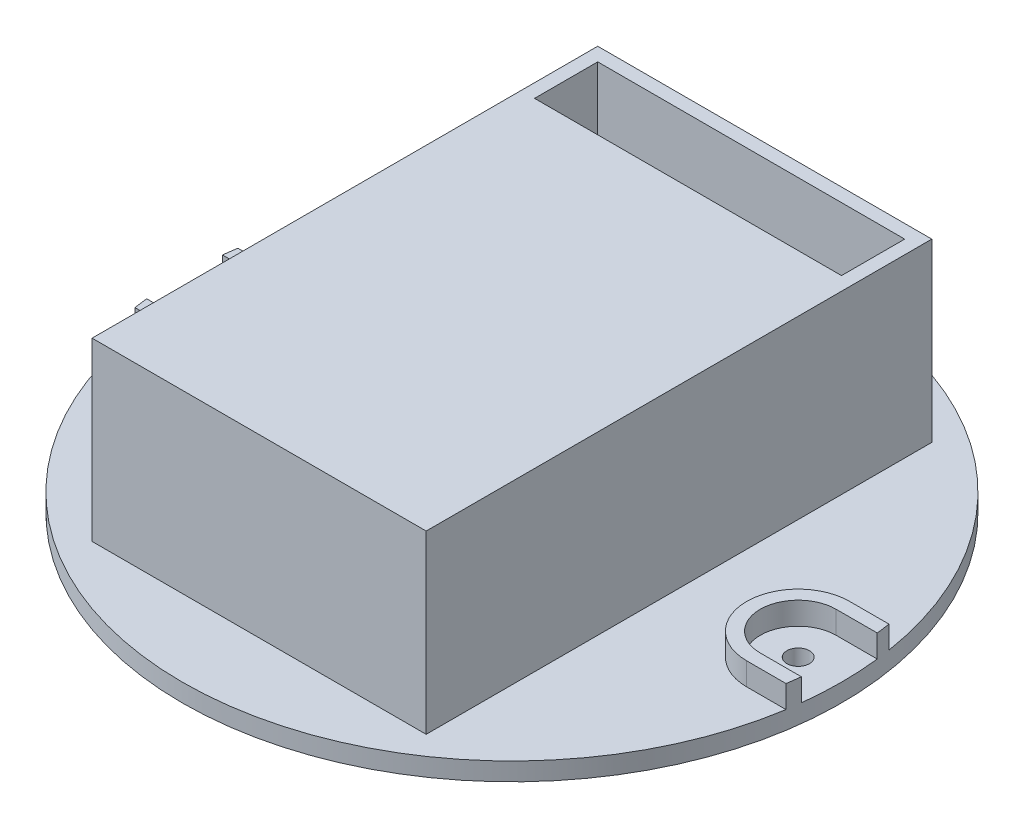
ISO-10303-21;
HEADER;
FILE_DESCRIPTION(('STEP AP214'),'2;1');
FILE_NAME('part.step','',(''),(''),'','','');
FILE_SCHEMA(('AUTOMOTIVE_DESIGN { 1 0 10303 214 1 1 1 1 }'));
ENDSEC;
DATA;
#1=APPLICATION_CONTEXT('core data for automotive mechanical design processes');
#2=APPLICATION_PROTOCOL_DEFINITION('international standard','automotive_design',2000,#1);
#3=PRODUCT_CONTEXT('',#1,'mechanical');
#4=PRODUCT('Part','Part','',(#3));
#5=PRODUCT_RELATED_PRODUCT_CATEGORY('part','',(#4));
#6=PRODUCT_DEFINITION_FORMATION('','',#4);
#7=PRODUCT_DEFINITION_CONTEXT('part definition',#1,'design');
#8=PRODUCT_DEFINITION('design','',#6,#7);
#9=PRODUCT_DEFINITION_SHAPE('','',#8);
#10=(LENGTH_UNIT() NAMED_UNIT(*) SI_UNIT(.MILLI.,.METRE.));
#11=(NAMED_UNIT(*) PLANE_ANGLE_UNIT() SI_UNIT($,.RADIAN.));
#12=(NAMED_UNIT(*) SI_UNIT($,.STERADIAN.) SOLID_ANGLE_UNIT());
#13=UNCERTAINTY_MEASURE_WITH_UNIT(LENGTH_MEASURE(1.E-05),#10,'distance_accuracy_value','');
#14=(GEOMETRIC_REPRESENTATION_CONTEXT(3) GLOBAL_UNCERTAINTY_ASSIGNED_CONTEXT((#13)) GLOBAL_UNIT_ASSIGNED_CONTEXT((#10,
#11,#12)) REPRESENTATION_CONTEXT('',''));
#15=CARTESIAN_POINT('',(0.,0.,0.));
#16=DIRECTION('',(0.,0.,1.));
#17=DIRECTION('',(1.,0.,0.));
#18=AXIS2_PLACEMENT_3D('',#15,#16,#17);
#19=CARTESIAN_POINT('',(0.,-90.5,-26.5));
#20=DIRECTION('',(0.,0.,-1.));
#21=DIRECTION('',(-1.,0.,0.));
#22=AXIS2_PLACEMENT_3D('',#19,#20,#21);
#23=PLANE('',#22);
#24=DIRECTION('',(0.,-1.,0.));
#25=VECTOR('',#24,1.);
#26=CARTESIAN_POINT('',(17.,-90.5,-26.5));
#27=LINE('',#26,#25);
#28=CARTESIAN_POINT('',(17.,-90.5,-26.5));
#29=VERTEX_POINT('',#28);
#30=CARTESIAN_POINT('',(17.,-112.,-26.5));
#31=VERTEX_POINT('',#30);
#32=EDGE_CURVE('E209',#29,#31,#27,.T.);
#33=ORIENTED_EDGE('',*,*,#32,.F.);
#34=DIRECTION('',(1.,0.,0.));
#35=VECTOR('',#34,1.);
#36=CARTESIAN_POINT('',(-17.,-90.5,-26.5));
#37=LINE('',#36,#35);
#38=CARTESIAN_POINT('',(-17.,-90.5,-26.5));
#39=VERTEX_POINT('',#38);
#40=EDGE_CURVE('E211',#39,#29,#37,.T.);
#41=ORIENTED_EDGE('',*,*,#40,.F.);
#42=DIRECTION('',(0.,-1.,0.));
#43=VECTOR('',#42,1.);
#44=CARTESIAN_POINT('',(-17.,-90.5,-26.5));
#45=LINE('',#44,#43);
#46=CARTESIAN_POINT('',(-17.,-112.,-26.5));
#47=VERTEX_POINT('',#46);
#48=EDGE_CURVE('E217',#39,#47,#45,.T.);
#49=ORIENTED_EDGE('',*,*,#48,.T.);
#50=DIRECTION('',(1.,0.,0.));
#51=VECTOR('',#50,1.);
#52=CARTESIAN_POINT('',(-17.,-112.,-26.5));
#53=LINE('',#52,#51);
#54=EDGE_CURVE('E214',#47,#31,#53,.T.);
#55=ORIENTED_EDGE('',*,*,#54,.T.);
#56=EDGE_LOOP('',(#33,#41,#49,#55));
#57=FACE_BOUND('',#56,.T.);
#58=ADVANCED_FACE('F35',(#57),#23,.F.);
#59=CARTESIAN_POINT('',(-17.,-90.5,0.));
#60=DIRECTION('',(-1.,0.,0.));
#61=DIRECTION('',(0.,0.,1.));
#62=AXIS2_PLACEMENT_3D('',#59,#60,#61);
#63=PLANE('',#62);
#64=ORIENTED_EDGE('',*,*,#48,.F.);
#65=DIRECTION('',(0.,0.,-1.));
#66=VECTOR('',#65,1.);
#67=CARTESIAN_POINT('',(-17.,-90.5,-26.5));
#68=LINE('',#67,#66);
#69=CARTESIAN_POINT('',(-17.,-90.5,-19.5));
#70=VERTEX_POINT('',#69);
#71=EDGE_CURVE('E230',#70,#39,#68,.T.);
#72=ORIENTED_EDGE('',*,*,#71,.F.);
#73=DIRECTION('',(0.,-1.,0.));
#74=VECTOR('',#73,1.);
#75=CARTESIAN_POINT('',(-17.,-0.498999999999999,-19.5));
#76=LINE('',#75,#74);
#77=CARTESIAN_POINT('',(-17.,-92.,-19.5));
#78=VERTEX_POINT('',#77);
#79=EDGE_CURVE('E226',#70,#78,#76,.T.);
#80=ORIENTED_EDGE('',*,*,#79,.T.);
#81=DIRECTION('',(0.,0.,1.));
#82=VECTOR('',#81,1.);
#83=CARTESIAN_POINT('',(-17.,-92.,0.));
#84=LINE('',#83,#82);
#85=CARTESIAN_POINT('',(-17.,-92.,26.5));
#86=VERTEX_POINT('',#85);
#87=EDGE_CURVE('E248',#78,#86,#84,.T.);
#88=ORIENTED_EDGE('',*,*,#87,.T.);
#89=DIRECTION('',(0.,-1.,0.));
#90=VECTOR('',#89,1.);
#91=CARTESIAN_POINT('',(-17.,-90.5,26.5));
#92=LINE('',#91,#90);
#93=CARTESIAN_POINT('',(-17.,-112.,26.5));
#94=VERTEX_POINT('',#93);
#95=EDGE_CURVE('E288',#86,#94,#92,.T.);
#96=ORIENTED_EDGE('',*,*,#95,.T.);
#97=DIRECTION('',(0.,0.,-1.));
#98=VECTOR('',#97,1.);
#99=CARTESIAN_POINT('',(-17.,-112.,26.5));
#100=LINE('',#99,#98);
#101=EDGE_CURVE('E245',#94,#47,#100,.T.);
#102=ORIENTED_EDGE('',*,*,#101,.T.);
#103=EDGE_LOOP('',(#64,#72,#80,#88,#96,#102));
#104=FACE_BOUND('',#103,.T.);
#105=ADVANCED_FACE('F485',(#104),#63,.F.);
#106=CARTESIAN_POINT('',(0.,-90.5,26.5));
#107=DIRECTION('',(0.,0.,-1.));
#108=DIRECTION('',(-1.,0.,0.));
#109=AXIS2_PLACEMENT_3D('',#106,#107,#108);
#110=PLANE('',#109);
#111=DIRECTION('',(-1.,0.,0.));
#112=VECTOR('',#111,1.);
#113=CARTESIAN_POINT('',(0.,-92.,26.5));
#114=LINE('',#113,#112);
#115=CARTESIAN_POINT('',(17.,-92.,26.5));
#116=VERTEX_POINT('',#115);
#117=EDGE_CURVE('E250',#116,#86,#114,.T.);
#118=ORIENTED_EDGE('',*,*,#117,.F.);
#119=DIRECTION('',(0.,-1.,0.));
#120=VECTOR('',#119,1.);
#121=CARTESIAN_POINT('',(17.,-90.5,26.5));
#122=LINE('',#121,#120);
#123=CARTESIAN_POINT('',(17.,-112.,26.5));
#124=VERTEX_POINT('',#123);
#125=EDGE_CURVE('E280',#116,#124,#122,.T.);
#126=ORIENTED_EDGE('',*,*,#125,.T.);
#127=DIRECTION('',(1.,0.,0.));
#128=VECTOR('',#127,1.);
#129=CARTESIAN_POINT('',(-17.,-112.,26.5));
#130=LINE('',#129,#128);
#131=EDGE_CURVE('E225',#94,#124,#130,.T.);
#132=ORIENTED_EDGE('',*,*,#131,.F.);
#133=ORIENTED_EDGE('',*,*,#95,.F.);
#134=EDGE_LOOP('',(#118,#126,#132,#133));
#135=FACE_BOUND('',#134,.T.);
#136=ADVANCED_FACE('F490',(#135),#110,.T.);
#137=CARTESIAN_POINT('',(17.,-90.5,0.));
#138=DIRECTION('',(-1.,0.,0.));
#139=DIRECTION('',(0.,0.,1.));
#140=AXIS2_PLACEMENT_3D('',#137,#138,#139);
#141=PLANE('',#140);
#142=DIRECTION('',(0.,0.,1.));
#143=VECTOR('',#142,1.);
#144=CARTESIAN_POINT('',(17.,-92.,0.));
#145=LINE('',#144,#143);
#146=CARTESIAN_POINT('',(17.,-92.,-19.5));
#147=VERTEX_POINT('',#146);
#148=EDGE_CURVE('E253',#147,#116,#145,.T.);
#149=ORIENTED_EDGE('',*,*,#148,.F.);
#150=DIRECTION('',(0.,-1.,0.));
#151=VECTOR('',#150,1.);
#152=CARTESIAN_POINT('',(17.,-0.498999999999999,-19.5));
#153=LINE('',#152,#151);
#154=CARTESIAN_POINT('',(17.,-90.5,-19.5));
#155=VERTEX_POINT('',#154);
#156=EDGE_CURVE('E51',#155,#147,#153,.T.);
#157=ORIENTED_EDGE('',*,*,#156,.F.);
#158=DIRECTION('',(0.,0.,1.));
#159=VECTOR('',#158,1.);
#160=CARTESIAN_POINT('',(17.,-90.5,-26.5));
#161=LINE('',#160,#159);
#162=EDGE_CURVE('E221',#29,#155,#161,.T.);
#163=ORIENTED_EDGE('',*,*,#162,.F.);
#164=ORIENTED_EDGE('',*,*,#32,.T.);
#165=DIRECTION('',(0.,0.,-1.));
#166=VECTOR('',#165,1.);
#167=CARTESIAN_POINT('',(17.,-112.,26.5));
#168=LINE('',#167,#166);
#169=EDGE_CURVE('E242',#124,#31,#168,.T.);
#170=ORIENTED_EDGE('',*,*,#169,.F.);
#171=ORIENTED_EDGE('',*,*,#125,.F.);
#172=EDGE_LOOP('',(#149,#157,#163,#164,#170,#171));
#173=FACE_BOUND('',#172,.T.);
#174=ADVANCED_FACE('F222',(#173),#141,.T.);
#175=CARTESIAN_POINT('',(0.,-92.,0.));
#176=DIRECTION('',(0.,-1.,0.));
#177=DIRECTION('',(0.,0.,-1.));
#178=AXIS2_PLACEMENT_3D('',#175,#176,#177);
#179=PLANE('',#178);
#180=DIRECTION('',(-1.,0.,0.));
#181=VECTOR('',#180,1.);
#182=CARTESIAN_POINT('',(17.,-92.,-19.5));
#183=LINE('',#182,#181);
#184=EDGE_CURVE('E231',#147,#78,#183,.T.);
#185=ORIENTED_EDGE('',*,*,#184,.F.);
#186=ORIENTED_EDGE('',*,*,#148,.T.);
#187=ORIENTED_EDGE('',*,*,#117,.T.);
#188=ORIENTED_EDGE('',*,*,#87,.F.);
#189=EDGE_LOOP('',(#185,#186,#187,#188));
#190=FACE_BOUND('',#189,.T.);
#191=ADVANCED_FACE('F502',(#190),#179,.T.);
#192=CARTESIAN_POINT('',(0.,-110.,0.));
#193=DIRECTION('',(0.,1.,0.));
#194=DIRECTION('',(0.,0.,1.));
#195=AXIS2_PLACEMENT_3D('',#192,#193,#194);
#196=PLANE('',#195);
#197=DIRECTION('',(0.,0.,-1.));
#198=VECTOR('',#197,1.);
#199=CARTESIAN_POINT('',(-18.5,-110.,0.));
#200=LINE('',#199,#198);
#201=CARTESIAN_POINT('',(-18.5,-110.,28.));
#202=VERTEX_POINT('',#201);
#203=CARTESIAN_POINT('',(-18.5,-110.,-28.));
#204=VERTEX_POINT('',#203);
#205=EDGE_CURVE('E255',#202,#204,#200,.T.);
#206=ORIENTED_EDGE('',*,*,#205,.T.);
#207=DIRECTION('',(1.,0.,0.));
#208=VECTOR('',#207,1.);
#209=CARTESIAN_POINT('',(0.,-110.,-28.));
#210=LINE('',#209,#208);
#211=CARTESIAN_POINT('',(18.5,-110.,-28.));
#212=VERTEX_POINT('',#211);
#213=EDGE_CURVE('E260',#204,#212,#210,.T.);
#214=ORIENTED_EDGE('',*,*,#213,.T.);
#215=DIRECTION('',(0.,0.,-1.));
#216=VECTOR('',#215,1.);
#217=CARTESIAN_POINT('',(18.5,-110.,0.));
#218=LINE('',#217,#216);
#219=CARTESIAN_POINT('',(18.5,-110.,28.));
#220=VERTEX_POINT('',#219);
#221=EDGE_CURVE('E272',#220,#212,#218,.T.);
#222=ORIENTED_EDGE('',*,*,#221,.F.);
#223=DIRECTION('',(1.,0.,0.));
#224=VECTOR('',#223,1.);
#225=CARTESIAN_POINT('',(0.,-110.,28.));
#226=LINE('',#225,#224);
#227=EDGE_CURVE('E269',#202,#220,#226,.T.);
#228=ORIENTED_EDGE('',*,*,#227,.F.);
#229=EDGE_LOOP('',(#206,#214,#222,#228));
#230=FACE_BOUND('',#229,.T.);
#231=CARTESIAN_POINT('',(31.7,-110.,0.));
#232=DIRECTION('',(0.,1.,0.));
#233=DIRECTION('',(0.,0.,1.));
#234=AXIS2_PLACEMENT_3D('',#231,#232,#233);
#235=CIRCLE('',#234,5.69999999999999);
#236=CARTESIAN_POINT('',(31.7,-110.,-5.7));
#237=VERTEX_POINT('',#236);
#238=CARTESIAN_POINT('',(31.7,-110.,5.69999999999999));
#239=VERTEX_POINT('',#238);
#240=EDGE_CURVE('E313',#237,#239,#235,.T.);
#241=ORIENTED_EDGE('',*,*,#240,.F.);
#242=DIRECTION('',(-1.,0.,0.));
#243=VECTOR('',#242,1.);
#244=CARTESIAN_POINT('',(0.,-110.,-5.69999999999998));
#245=LINE('',#244,#243);
#246=CARTESIAN_POINT('',(36.0521843998391,-110.,-5.69999999999999));
#247=VERTEX_POINT('',#246);
#248=EDGE_CURVE('E285',#247,#237,#245,.T.);
#249=ORIENTED_EDGE('',*,*,#248,.F.);
#250=CARTESIAN_POINT('',(0.,-110.,0.));
#251=DIRECTION('',(0.,1.,0.));
#252=DIRECTION('',(0.,0.,1.));
#253=AXIS2_PLACEMENT_3D('',#250,#251,#252);
#254=CIRCLE('',#253,36.5);
#255=CARTESIAN_POINT('',(-36.0521843998391,-110.,-5.69999999999999));
#256=VERTEX_POINT('',#255);
#257=EDGE_CURVE('E405',#247,#256,#254,.T.);
#258=ORIENTED_EDGE('',*,*,#257,.T.);
#259=DIRECTION('',(1.,0.,0.));
#260=VECTOR('',#259,1.);
#261=CARTESIAN_POINT('',(0.,-110.,-5.70000000000019));
#262=LINE('',#261,#260);
#263=CARTESIAN_POINT('',(-31.7,-110.,-5.70000000000001));
#264=VERTEX_POINT('',#263);
#265=EDGE_CURVE('E374',#256,#264,#262,.T.);
#266=ORIENTED_EDGE('',*,*,#265,.T.);
#267=CARTESIAN_POINT('',(-31.7,-110.,0.));
#268=DIRECTION('',(0.,1.,0.));
#269=DIRECTION('',(0.,0.,1.));
#270=AXIS2_PLACEMENT_3D('',#267,#268,#269);
#271=CIRCLE('',#270,5.70000000000001);
#272=CARTESIAN_POINT('',(-31.7,-110.,5.70000000000001));
#273=VERTEX_POINT('',#272);
#274=EDGE_CURVE('E371',#273,#264,#271,.T.);
#275=ORIENTED_EDGE('',*,*,#274,.F.);
#276=DIRECTION('',(1.,0.,0.));
#277=VECTOR('',#276,1.);
#278=CARTESIAN_POINT('',(0.,-110.,5.70000000000001));
#279=LINE('',#278,#277);
#280=CARTESIAN_POINT('',(-36.0521843998391,-110.,5.70000000000001));
#281=VERTEX_POINT('',#280);
#282=EDGE_CURVE('E348',#281,#273,#279,.T.);
#283=ORIENTED_EDGE('',*,*,#282,.F.);
#284=CARTESIAN_POINT('',(36.0521843998391,-110.,5.7));
#285=VERTEX_POINT('',#284);
#286=EDGE_CURVE('E39',#281,#285,#254,.T.);
#287=ORIENTED_EDGE('',*,*,#286,.T.);
#288=DIRECTION('',(-1.,0.,0.));
#289=VECTOR('',#288,1.);
#290=CARTESIAN_POINT('',(0.,-110.,5.69999999999994));
#291=LINE('',#290,#289);
#292=EDGE_CURVE('E316',#285,#239,#291,.T.);
#293=ORIENTED_EDGE('',*,*,#292,.T.);
#294=EDGE_LOOP('',(#241,#249,#258,#266,#275,#283,#287,#293));
#295=FACE_BOUND('',#294,.T.);
#296=ADVANCED_FACE('F439',(#230,#295),#196,.T.);
#297=CARTESIAN_POINT('',(31.7,-110.,0.));
#298=DIRECTION('',(0.,1.,0.));
#299=DIRECTION('',(0.,0.,1.));
#300=AXIS2_PLACEMENT_3D('',#297,#298,#299);
#301=CIRCLE('',#300,1.25);
#302=CARTESIAN_POINT('',(31.7,-110.,1.24999999999999));
#303=VERTEX_POINT('',#302);
#304=EDGE_CURVE('E803',#303,#303,#301,.T.);
#305=ORIENTED_EDGE('',*,*,#304,.F.);
#306=EDGE_LOOP('',(#305));
#307=FACE_BOUND('',#306,.T.);
#308=CARTESIAN_POINT('',(31.7,-110.,0.));
#309=DIRECTION('',(0.,1.,0.));
#310=DIRECTION('',(0.,0.,1.));
#311=AXIS2_PLACEMENT_3D('',#308,#309,#310);
#312=CIRCLE('',#311,4.19999999999999);
#313=CARTESIAN_POINT('',(31.7,-110.,-4.19999999999999));
#314=VERTEX_POINT('',#313);
#315=CARTESIAN_POINT('',(31.7,-110.,4.19999999999999));
#316=VERTEX_POINT('',#315);
#317=EDGE_CURVE('E321',#314,#316,#312,.T.);
#318=ORIENTED_EDGE('',*,*,#317,.T.);
#319=DIRECTION('',(-1.,0.,0.));
#320=VECTOR('',#319,1.);
#321=CARTESIAN_POINT('',(0.,-110.,4.19999999999995));
#322=LINE('',#321,#320);
#323=CARTESIAN_POINT('',(36.2575509377012,-110.,4.2));
#324=VERTEX_POINT('',#323);
#325=EDGE_CURVE('E318',#324,#316,#322,.T.);
#326=ORIENTED_EDGE('',*,*,#325,.F.);
#327=CARTESIAN_POINT('',(36.2575509377012,-110.,-4.19999999999999));
#328=VERTEX_POINT('',#327);
#329=EDGE_CURVE('E408',#324,#328,#254,.T.);
#330=ORIENTED_EDGE('',*,*,#329,.T.);
#331=DIRECTION('',(-1.,0.,0.));
#332=VECTOR('',#331,1.);
#333=CARTESIAN_POINT('',(0.,-110.,-4.19999999999999));
#334=LINE('',#333,#332);
#335=EDGE_CURVE('E295',#328,#314,#334,.T.);
#336=ORIENTED_EDGE('',*,*,#335,.T.);
#337=EDGE_LOOP('',(#318,#326,#330,#336));
#338=FACE_BOUND('',#337,.T.);
#339=ADVANCED_FACE('F469',(#307,#338),#196,.T.);
#340=CARTESIAN_POINT('',(-31.7,-110.,0.));
#341=DIRECTION('',(0.,1.,0.));
#342=DIRECTION('',(0.,0.,1.));
#343=AXIS2_PLACEMENT_3D('',#340,#341,#342);
#344=CIRCLE('',#343,1.24999999999999);
#345=CARTESIAN_POINT('',(-31.7,-110.,1.24999999999999));
#346=VERTEX_POINT('',#345);
#347=EDGE_CURVE('E795',#346,#346,#344,.T.);
#348=ORIENTED_EDGE('',*,*,#347,.F.);
#349=EDGE_LOOP('',(#348));
#350=FACE_BOUND('',#349,.T.);
#351=CARTESIAN_POINT('',(-36.2575509377012,-110.,-4.20000000000001));
#352=VERTEX_POINT('',#351);
#353=CARTESIAN_POINT('',(-36.2575509377012,-110.,4.2));
#354=VERTEX_POINT('',#353);
#355=EDGE_CURVE('E44',#352,#354,#254,.T.);
#356=ORIENTED_EDGE('',*,*,#355,.T.);
#357=DIRECTION('',(1.,0.,0.));
#358=VECTOR('',#357,1.);
#359=CARTESIAN_POINT('',(0.,-110.,4.2));
#360=LINE('',#359,#358);
#361=CARTESIAN_POINT('',(-31.7,-110.,4.2));
#362=VERTEX_POINT('',#361);
#363=EDGE_CURVE('E353',#354,#362,#360,.T.);
#364=ORIENTED_EDGE('',*,*,#363,.T.);
#365=CARTESIAN_POINT('',(-31.7,-110.,0.));
#366=DIRECTION('',(0.,1.,0.));
#367=DIRECTION('',(0.,0.,1.));
#368=AXIS2_PLACEMENT_3D('',#365,#366,#367);
#369=CIRCLE('',#368,4.2);
#370=CARTESIAN_POINT('',(-31.7,-110.,-4.20000000000001));
#371=VERTEX_POINT('',#370);
#372=EDGE_CURVE('E379',#362,#371,#369,.T.);
#373=ORIENTED_EDGE('',*,*,#372,.T.);
#374=DIRECTION('',(1.,0.,0.));
#375=VECTOR('',#374,1.);
#376=CARTESIAN_POINT('',(0.,-110.,-4.2));
#377=LINE('',#376,#375);
#378=EDGE_CURVE('E376',#352,#371,#377,.T.);
#379=ORIENTED_EDGE('',*,*,#378,.F.);
#380=EDGE_LOOP('',(#356,#364,#373,#379));
#381=FACE_BOUND('',#380,.T.);
#382=ADVANCED_FACE('F414',(#350,#381),#196,.T.);
#383=CARTESIAN_POINT('',(0.,-112.,0.));
#384=DIRECTION('',(0.,1.,0.));
#385=DIRECTION('',(0.,0.,1.));
#386=AXIS2_PLACEMENT_3D('',#383,#384,#385);
#387=CYLINDRICAL_SURFACE('',#386,36.5);
#388=CARTESIAN_POINT('',(0.,-112.,0.));
#389=DIRECTION('',(0.,1.,0.));
#390=DIRECTION('',(0.,0.,1.));
#391=AXIS2_PLACEMENT_3D('',#388,#389,#390);
#392=CIRCLE('',#391,36.5);
#393=CARTESIAN_POINT('',(0.,-112.,36.5));
#394=VERTEX_POINT('',#393);
#395=EDGE_CURVE('E11',#394,#394,#392,.T.);
#396=ORIENTED_EDGE('',*,*,#395,.T.);
#397=EDGE_LOOP('',(#396));
#398=FACE_BOUND('',#397,.T.);
#399=ORIENTED_EDGE('',*,*,#355,.F.);
#400=DIRECTION('',(0.,-1.,0.));
#401=VECTOR('',#400,1.);
#402=CARTESIAN_POINT('',(-36.2575509377012,-107.5,-4.20000000000001));
#403=LINE('',#402,#401);
#404=CARTESIAN_POINT('',(-36.2575509377012,-107.5,-4.20000000000001));
#405=VERTEX_POINT('',#404);
#406=EDGE_CURVE('E394',#405,#352,#403,.T.);
#407=ORIENTED_EDGE('',*,*,#406,.F.);
#408=CARTESIAN_POINT('',(0.,-107.5,0.));
#409=DIRECTION('',(0.,1.,0.));
#410=DIRECTION('',(0.,0.,1.));
#411=AXIS2_PLACEMENT_3D('',#408,#409,#410);
#412=CIRCLE('',#411,36.5);
#413=CARTESIAN_POINT('',(-36.0521843998391,-107.5,-5.69999999999999));
#414=VERTEX_POINT('',#413);
#415=EDGE_CURVE('E358',#414,#405,#412,.T.);
#416=ORIENTED_EDGE('',*,*,#415,.F.);
#417=DIRECTION('',(0.,-1.,0.));
#418=VECTOR('',#417,1.);
#419=CARTESIAN_POINT('',(-36.0521843998391,-107.5,-5.69999999999999));
#420=LINE('',#419,#418);
#421=EDGE_CURVE('E397',#414,#256,#420,.T.);
#422=ORIENTED_EDGE('',*,*,#421,.T.);
#423=ORIENTED_EDGE('',*,*,#257,.F.);
#424=DIRECTION('',(0.,-1.,0.));
#425=VECTOR('',#424,1.);
#426=CARTESIAN_POINT('',(36.0521843998391,-107.5,-5.69999999999999));
#427=LINE('',#426,#425);
#428=CARTESIAN_POINT('',(36.0521843998391,-107.5,-5.69999999999999));
#429=VERTEX_POINT('',#428);
#430=EDGE_CURVE('E324',#429,#247,#427,.T.);
#431=ORIENTED_EDGE('',*,*,#430,.F.);
#432=CARTESIAN_POINT('',(0.,-107.5,0.));
#433=DIRECTION('',(0.,1.,0.));
#434=DIRECTION('',(0.,0.,1.));
#435=AXIS2_PLACEMENT_3D('',#432,#433,#434);
#436=CIRCLE('',#435,36.5);
#437=CARTESIAN_POINT('',(36.2575509377012,-107.5,-4.19999999999999));
#438=VERTEX_POINT('',#437);
#439=EDGE_CURVE('E303',#438,#429,#436,.T.);
#440=ORIENTED_EDGE('',*,*,#439,.F.);
#441=DIRECTION('',(0.,-1.,0.));
#442=VECTOR('',#441,1.);
#443=CARTESIAN_POINT('',(36.2575509377012,-107.5,-4.19999999999999));
#444=LINE('',#443,#442);
#445=EDGE_CURVE('E327',#438,#328,#444,.T.);
#446=ORIENTED_EDGE('',*,*,#445,.T.);
#447=ORIENTED_EDGE('',*,*,#329,.F.);
#448=DIRECTION('',(0.,-1.,0.));
#449=VECTOR('',#448,1.);
#450=CARTESIAN_POINT('',(36.2575509377012,-107.5,4.2));
#451=LINE('',#450,#449);
#452=CARTESIAN_POINT('',(36.2575509377012,-107.5,4.2));
#453=VERTEX_POINT('',#452);
#454=EDGE_CURVE('E336',#453,#324,#451,.T.);
#455=ORIENTED_EDGE('',*,*,#454,.F.);
#456=CARTESIAN_POINT('',(36.0521843998391,-107.5,5.7));
#457=VERTEX_POINT('',#456);
#458=EDGE_CURVE('E300',#457,#453,#436,.T.);
#459=ORIENTED_EDGE('',*,*,#458,.F.);
#460=DIRECTION('',(0.,-1.,0.));
#461=VECTOR('',#460,1.);
#462=CARTESIAN_POINT('',(36.0521843998391,-107.5,5.7));
#463=LINE('',#462,#461);
#464=EDGE_CURVE('E339',#457,#285,#463,.T.);
#465=ORIENTED_EDGE('',*,*,#464,.T.);
#466=ORIENTED_EDGE('',*,*,#286,.F.);
#467=DIRECTION('',(0.,-1.,0.));
#468=VECTOR('',#467,1.);
#469=CARTESIAN_POINT('',(-36.0521843998391,-107.5,5.70000000000001));
#470=LINE('',#469,#468);
#471=CARTESIAN_POINT('',(-36.0521843998391,-107.5,5.70000000000001));
#472=VERTEX_POINT('',#471);
#473=EDGE_CURVE('E382',#472,#281,#470,.T.);
#474=ORIENTED_EDGE('',*,*,#473,.F.);
#475=CARTESIAN_POINT('',(-36.2575509377012,-107.5,4.2));
#476=VERTEX_POINT('',#475);
#477=EDGE_CURVE('E361',#476,#472,#412,.T.);
#478=ORIENTED_EDGE('',*,*,#477,.F.);
#479=DIRECTION('',(0.,-1.,0.));
#480=VECTOR('',#479,1.);
#481=CARTESIAN_POINT('',(-36.2575509377012,-107.5,4.2));
#482=LINE('',#481,#480);
#483=EDGE_CURVE('E385',#476,#354,#482,.T.);
#484=ORIENTED_EDGE('',*,*,#483,.T.);
#485=EDGE_LOOP('',(#399,#407,#416,#422,#423,#431,#440,#446,#447,#455,#459,#465,#466,#474,#478,#484));
#486=FACE_BOUND('',#485,.T.);
#487=ADVANCED_FACE('F37',(#398,#486),#387,.T.);
#488=CARTESIAN_POINT('',(0.,-112.,0.));
#489=DIRECTION('',(0.,1.,0.));
#490=DIRECTION('',(0.,0.,1.));
#491=AXIS2_PLACEMENT_3D('',#488,#489,#490);
#492=PLANE('',#491);
#493=CARTESIAN_POINT('',(31.7,-112.,0.));
#494=DIRECTION('',(0.,1.,0.));
#495=DIRECTION('',(0.,0.,1.));
#496=AXIS2_PLACEMENT_3D('',#493,#494,#495);
#497=CIRCLE('',#496,1.25);
#498=CARTESIAN_POINT('',(31.7,-112.,1.24999999999999));
#499=VERTEX_POINT('',#498);
#500=EDGE_CURVE('E800',#499,#499,#497,.F.);
#501=ORIENTED_EDGE('',*,*,#500,.F.);
#502=EDGE_LOOP('',(#501));
#503=FACE_BOUND('',#502,.T.);
#504=CARTESIAN_POINT('',(-31.7,-112.,0.));
#505=DIRECTION('',(0.,1.,0.));
#506=DIRECTION('',(0.,0.,1.));
#507=AXIS2_PLACEMENT_3D('',#504,#505,#506);
#508=CIRCLE('',#507,1.24999999999999);
#509=CARTESIAN_POINT('',(-31.7,-112.,1.24999999999999));
#510=VERTEX_POINT('',#509);
#511=EDGE_CURVE('E793',#510,#510,#508,.F.);
#512=ORIENTED_EDGE('',*,*,#511,.F.);
#513=EDGE_LOOP('',(#512));
#514=FACE_BOUND('',#513,.T.);
#515=ORIENTED_EDGE('',*,*,#101,.F.);
#516=ORIENTED_EDGE('',*,*,#131,.T.);
#517=ORIENTED_EDGE('',*,*,#169,.T.);
#518=ORIENTED_EDGE('',*,*,#54,.F.);
#519=EDGE_LOOP('',(#515,#516,#517,#518));
#520=FACE_BOUND('',#519,.T.);
#521=ORIENTED_EDGE('',*,*,#395,.F.);
#522=EDGE_LOOP('',(#521));
#523=FACE_BOUND('',#522,.T.);
#524=ADVANCED_FACE('F592',(#503,#514,#520,#523),#492,.F.);
#525=CARTESIAN_POINT('',(0.,-107.5,5.70000000000001));
#526=DIRECTION('',(0.,0.,-1.));
#527=DIRECTION('',(-1.,0.,0.));
#528=AXIS2_PLACEMENT_3D('',#525,#526,#527);
#529=PLANE('',#528);
#530=ORIENTED_EDGE('',*,*,#282,.T.);
#531=DIRECTION('',(0.,-1.,0.));
#532=VECTOR('',#531,1.);
#533=CARTESIAN_POINT('',(-31.7,-107.5,5.70000000000001));
#534=LINE('',#533,#532);
#535=CARTESIAN_POINT('',(-31.7,-107.5,5.70000000000001));
#536=VERTEX_POINT('',#535);
#537=EDGE_CURVE('E403',#536,#273,#534,.T.);
#538=ORIENTED_EDGE('',*,*,#537,.F.);
#539=DIRECTION('',(1.,0.,0.));
#540=VECTOR('',#539,1.);
#541=CARTESIAN_POINT('',(0.,-107.5,5.70000000000001));
#542=LINE('',#541,#540);
#543=EDGE_CURVE('E349',#472,#536,#542,.T.);
#544=ORIENTED_EDGE('',*,*,#543,.F.);
#545=ORIENTED_EDGE('',*,*,#473,.T.);
#546=EDGE_LOOP('',(#530,#538,#544,#545));
#547=FACE_BOUND('',#546,.T.);
#548=ADVANCED_FACE('F443',(#547),#529,.F.);
#549=CARTESIAN_POINT('',(-31.7,-107.5,0.));
#550=DIRECTION('',(0.,-1.,0.));
#551=DIRECTION('',(0.,0.,-1.));
#552=AXIS2_PLACEMENT_3D('',#549,#550,#551);
#553=CYLINDRICAL_SURFACE('',#552,5.70000000000001);
#554=ORIENTED_EDGE('',*,*,#274,.T.);
#555=DIRECTION('',(0.,-1.,0.));
#556=VECTOR('',#555,1.);
#557=CARTESIAN_POINT('',(-31.7,-107.5,-5.70000000000001));
#558=LINE('',#557,#556);
#559=CARTESIAN_POINT('',(-31.7,-107.5,-5.70000000000001));
#560=VERTEX_POINT('',#559);
#561=EDGE_CURVE('E400',#560,#264,#558,.T.);
#562=ORIENTED_EDGE('',*,*,#561,.F.);
#563=CARTESIAN_POINT('',(-31.7,-107.5,0.));
#564=DIRECTION('',(0.,1.,0.));
#565=DIRECTION('',(0.,0.,1.));
#566=AXIS2_PLACEMENT_3D('',#563,#564,#565);
#567=CIRCLE('',#566,5.70000000000001);
#568=EDGE_CURVE('E352',#536,#560,#567,.T.);
#569=ORIENTED_EDGE('',*,*,#568,.F.);
#570=ORIENTED_EDGE('',*,*,#537,.T.);
#571=EDGE_LOOP('',(#554,#562,#569,#570));
#572=FACE_BOUND('',#571,.T.);
#573=ADVANCED_FACE('F440',(#572),#553,.T.);
#574=CARTESIAN_POINT('',(0.,-107.5,-5.70000000000019));
#575=DIRECTION('',(0.,0.,-1.));
#576=DIRECTION('',(-1.,0.,0.));
#577=AXIS2_PLACEMENT_3D('',#574,#575,#576);
#578=PLANE('',#577);
#579=ORIENTED_EDGE('',*,*,#265,.F.);
#580=ORIENTED_EDGE('',*,*,#421,.F.);
#581=DIRECTION('',(1.,0.,0.));
#582=VECTOR('',#581,1.);
#583=CARTESIAN_POINT('',(0.,-107.5,-5.70000000000019));
#584=LINE('',#583,#582);
#585=EDGE_CURVE('E355',#414,#560,#584,.T.);
#586=ORIENTED_EDGE('',*,*,#585,.T.);
#587=ORIENTED_EDGE('',*,*,#561,.T.);
#588=EDGE_LOOP('',(#579,#580,#586,#587));
#589=FACE_BOUND('',#588,.T.);
#590=ADVANCED_FACE('F438',(#589),#578,.T.);
#591=CARTESIAN_POINT('',(0.,-107.5,-4.2));
#592=DIRECTION('',(0.,0.,-1.));
#593=DIRECTION('',(-1.,0.,0.));
#594=AXIS2_PLACEMENT_3D('',#591,#592,#593);
#595=PLANE('',#594);
#596=ORIENTED_EDGE('',*,*,#378,.T.);
#597=DIRECTION('',(0.,-1.,0.));
#598=VECTOR('',#597,1.);
#599=CARTESIAN_POINT('',(-31.7,-107.5,-4.20000000000001));
#600=LINE('',#599,#598);
#601=CARTESIAN_POINT('',(-31.7,-107.5,-4.20000000000001));
#602=VERTEX_POINT('',#601);
#603=EDGE_CURVE('E391',#602,#371,#600,.T.);
#604=ORIENTED_EDGE('',*,*,#603,.F.);
#605=DIRECTION('',(1.,0.,0.));
#606=VECTOR('',#605,1.);
#607=CARTESIAN_POINT('',(0.,-107.5,-4.2));
#608=LINE('',#607,#606);
#609=EDGE_CURVE('E360',#405,#602,#608,.T.);
#610=ORIENTED_EDGE('',*,*,#609,.F.);
#611=ORIENTED_EDGE('',*,*,#406,.T.);
#612=EDGE_LOOP('',(#596,#604,#610,#611));
#613=FACE_BOUND('',#612,.T.);
#614=ADVANCED_FACE('F430',(#613),#595,.F.);
#615=CARTESIAN_POINT('',(-31.7,-107.5,0.));
#616=DIRECTION('',(0.,-1.,0.));
#617=DIRECTION('',(0.,0.,-1.));
#618=AXIS2_PLACEMENT_3D('',#615,#616,#617);
#619=CYLINDRICAL_SURFACE('',#618,4.2);
#620=ORIENTED_EDGE('',*,*,#372,.F.);
#621=DIRECTION('',(0.,-1.,0.));
#622=VECTOR('',#621,1.);
#623=CARTESIAN_POINT('',(-31.7,-107.5,4.2));
#624=LINE('',#623,#622);
#625=CARTESIAN_POINT('',(-31.7,-107.5,4.2));
#626=VERTEX_POINT('',#625);
#627=EDGE_CURVE('E388',#626,#362,#624,.T.);
#628=ORIENTED_EDGE('',*,*,#627,.F.);
#629=CARTESIAN_POINT('',(-31.7,-107.5,0.));
#630=DIRECTION('',(0.,1.,0.));
#631=DIRECTION('',(0.,0.,1.));
#632=AXIS2_PLACEMENT_3D('',#629,#630,#631);
#633=CIRCLE('',#632,4.2);
#634=EDGE_CURVE('E363',#626,#602,#633,.T.);
#635=ORIENTED_EDGE('',*,*,#634,.T.);
#636=ORIENTED_EDGE('',*,*,#603,.T.);
#637=EDGE_LOOP('',(#620,#628,#635,#636));
#638=FACE_BOUND('',#637,.T.);
#639=ADVANCED_FACE('F426',(#638),#619,.F.);
#640=CARTESIAN_POINT('',(0.,-107.5,4.2));
#641=DIRECTION('',(0.,0.,-1.));
#642=DIRECTION('',(-1.,0.,0.));
#643=AXIS2_PLACEMENT_3D('',#640,#641,#642);
#644=PLANE('',#643);
#645=ORIENTED_EDGE('',*,*,#363,.F.);
#646=ORIENTED_EDGE('',*,*,#483,.F.);
#647=DIRECTION('',(1.,0.,0.));
#648=VECTOR('',#647,1.);
#649=CARTESIAN_POINT('',(0.,-107.5,4.2));
#650=LINE('',#649,#648);
#651=EDGE_CURVE('E366',#476,#626,#650,.T.);
#652=ORIENTED_EDGE('',*,*,#651,.T.);
#653=ORIENTED_EDGE('',*,*,#627,.T.);
#654=EDGE_LOOP('',(#645,#646,#652,#653));
#655=FACE_BOUND('',#654,.T.);
#656=ADVANCED_FACE('F422',(#655),#644,.T.);
#657=CARTESIAN_POINT('',(0.,-107.5,0.));
#658=DIRECTION('',(0.,1.,0.));
#659=DIRECTION('',(0.,0.,1.));
#660=AXIS2_PLACEMENT_3D('',#657,#658,#659);
#661=PLANE('',#660);
#662=ORIENTED_EDGE('',*,*,#543,.T.);
#663=ORIENTED_EDGE('',*,*,#568,.T.);
#664=ORIENTED_EDGE('',*,*,#585,.F.);
#665=ORIENTED_EDGE('',*,*,#415,.T.);
#666=ORIENTED_EDGE('',*,*,#609,.T.);
#667=ORIENTED_EDGE('',*,*,#634,.F.);
#668=ORIENTED_EDGE('',*,*,#651,.F.);
#669=ORIENTED_EDGE('',*,*,#477,.T.);
#670=EDGE_LOOP('',(#662,#663,#664,#665,#666,#667,#668,#669));
#671=FACE_BOUND('',#670,.T.);
#672=ADVANCED_FACE('F435',(#671),#661,.T.);
#673=CARTESIAN_POINT('',(0.,-107.5,-5.69999999999998));
#674=DIRECTION('',(0.,0.,1.));
#675=DIRECTION('',(1.,0.,0.));
#676=AXIS2_PLACEMENT_3D('',#673,#674,#675);
#677=PLANE('',#676);
#678=ORIENTED_EDGE('',*,*,#248,.T.);
#679=DIRECTION('',(0.,-1.,0.));
#680=VECTOR('',#679,1.);
#681=CARTESIAN_POINT('',(31.7,-107.5,-5.69999999999999));
#682=LINE('',#681,#680);
#683=CARTESIAN_POINT('',(31.7,-107.5,-5.69999999999999));
#684=VERTEX_POINT('',#683);
#685=EDGE_CURVE('E345',#684,#237,#682,.T.);
#686=ORIENTED_EDGE('',*,*,#685,.F.);
#687=DIRECTION('',(-1.,0.,0.));
#688=VECTOR('',#687,1.);
#689=CARTESIAN_POINT('',(0.,-107.5,-5.69999999999998));
#690=LINE('',#689,#688);
#691=EDGE_CURVE('E291',#429,#684,#690,.T.);
#692=ORIENTED_EDGE('',*,*,#691,.F.);
#693=ORIENTED_EDGE('',*,*,#430,.T.);
#694=EDGE_LOOP('',(#678,#686,#692,#693));
#695=FACE_BOUND('',#694,.T.);
#696=ADVANCED_FACE('F456',(#695),#677,.F.);
#697=CARTESIAN_POINT('',(31.7,-107.5,0.));
#698=DIRECTION('',(0.,-1.,0.));
#699=DIRECTION('',(0.,0.,-1.));
#700=AXIS2_PLACEMENT_3D('',#697,#698,#699);
#701=CYLINDRICAL_SURFACE('',#700,5.69999999999999);
#702=ORIENTED_EDGE('',*,*,#240,.T.);
#703=DIRECTION('',(0.,-1.,0.));
#704=VECTOR('',#703,1.);
#705=CARTESIAN_POINT('',(31.7,-107.5,5.69999999999999));
#706=LINE('',#705,#704);
#707=CARTESIAN_POINT('',(31.7,-107.5,5.69999999999999));
#708=VERTEX_POINT('',#707);
#709=EDGE_CURVE('E342',#708,#239,#706,.T.);
#710=ORIENTED_EDGE('',*,*,#709,.F.);
#711=CARTESIAN_POINT('',(31.7,-107.5,0.));
#712=DIRECTION('',(0.,1.,0.));
#713=DIRECTION('',(0.,0.,1.));
#714=AXIS2_PLACEMENT_3D('',#711,#712,#713);
#715=CIRCLE('',#714,5.69999999999999);
#716=EDGE_CURVE('E294',#684,#708,#715,.T.);
#717=ORIENTED_EDGE('',*,*,#716,.F.);
#718=ORIENTED_EDGE('',*,*,#685,.T.);
#719=EDGE_LOOP('',(#702,#710,#717,#718));
#720=FACE_BOUND('',#719,.T.);
#721=ADVANCED_FACE('F453',(#720),#701,.T.);
#722=CARTESIAN_POINT('',(0.,-107.5,5.69999999999994));
#723=DIRECTION('',(0.,0.,1.));
#724=DIRECTION('',(1.,0.,0.));
#725=AXIS2_PLACEMENT_3D('',#722,#723,#724);
#726=PLANE('',#725);
#727=ORIENTED_EDGE('',*,*,#292,.F.);
#728=ORIENTED_EDGE('',*,*,#464,.F.);
#729=DIRECTION('',(-1.,0.,0.));
#730=VECTOR('',#729,1.);
#731=CARTESIAN_POINT('',(0.,-107.5,5.69999999999994));
#732=LINE('',#731,#730);
#733=EDGE_CURVE('E297',#457,#708,#732,.T.);
#734=ORIENTED_EDGE('',*,*,#733,.T.);
#735=ORIENTED_EDGE('',*,*,#709,.T.);
#736=EDGE_LOOP('',(#727,#728,#734,#735));
#737=FACE_BOUND('',#736,.T.);
#738=ADVANCED_FACE('F449',(#737),#726,.T.);
#739=CARTESIAN_POINT('',(0.,-107.5,4.19999999999995));
#740=DIRECTION('',(0.,0.,1.));
#741=DIRECTION('',(1.,0.,0.));
#742=AXIS2_PLACEMENT_3D('',#739,#740,#741);
#743=PLANE('',#742);
#744=ORIENTED_EDGE('',*,*,#325,.T.);
#745=DIRECTION('',(0.,-1.,0.));
#746=VECTOR('',#745,1.);
#747=CARTESIAN_POINT('',(31.7,-107.5,4.19999999999999));
#748=LINE('',#747,#746);
#749=CARTESIAN_POINT('',(31.7,-107.5,4.19999999999999));
#750=VERTEX_POINT('',#749);
#751=EDGE_CURVE('E333',#750,#316,#748,.T.);
#752=ORIENTED_EDGE('',*,*,#751,.F.);
#753=DIRECTION('',(-1.,0.,0.));
#754=VECTOR('',#753,1.);
#755=CARTESIAN_POINT('',(0.,-107.5,4.19999999999995));
#756=LINE('',#755,#754);
#757=EDGE_CURVE('E302',#453,#750,#756,.T.);
#758=ORIENTED_EDGE('',*,*,#757,.F.);
#759=ORIENTED_EDGE('',*,*,#454,.T.);
#760=EDGE_LOOP('',(#744,#752,#758,#759));
#761=FACE_BOUND('',#760,.T.);
#762=ADVANCED_FACE('F472',(#761),#743,.F.);
#763=CARTESIAN_POINT('',(31.7,-107.5,0.));
#764=DIRECTION('',(0.,-1.,0.));
#765=DIRECTION('',(0.,0.,-1.));
#766=AXIS2_PLACEMENT_3D('',#763,#764,#765);
#767=CYLINDRICAL_SURFACE('',#766,4.19999999999999);
#768=ORIENTED_EDGE('',*,*,#317,.F.);
#769=DIRECTION('',(0.,-1.,0.));
#770=VECTOR('',#769,1.);
#771=CARTESIAN_POINT('',(31.7,-107.5,-4.19999999999999));
#772=LINE('',#771,#770);
#773=CARTESIAN_POINT('',(31.7,-107.5,-4.19999999999999));
#774=VERTEX_POINT('',#773);
#775=EDGE_CURVE('E330',#774,#314,#772,.T.);
#776=ORIENTED_EDGE('',*,*,#775,.F.);
#777=CARTESIAN_POINT('',(31.7,-107.5,0.));
#778=DIRECTION('',(0.,1.,0.));
#779=DIRECTION('',(0.,0.,1.));
#780=AXIS2_PLACEMENT_3D('',#777,#778,#779);
#781=CIRCLE('',#780,4.19999999999999);
#782=EDGE_CURVE('E305',#774,#750,#781,.T.);
#783=ORIENTED_EDGE('',*,*,#782,.T.);
#784=ORIENTED_EDGE('',*,*,#751,.T.);
#785=EDGE_LOOP('',(#768,#776,#783,#784));
#786=FACE_BOUND('',#785,.T.);
#787=ADVANCED_FACE('F475',(#786),#767,.F.);
#788=CARTESIAN_POINT('',(0.,-107.5,-4.19999999999999));
#789=DIRECTION('',(0.,0.,1.));
#790=DIRECTION('',(1.,0.,0.));
#791=AXIS2_PLACEMENT_3D('',#788,#789,#790);
#792=PLANE('',#791);
#793=ORIENTED_EDGE('',*,*,#335,.F.);
#794=ORIENTED_EDGE('',*,*,#445,.F.);
#795=DIRECTION('',(-1.,0.,0.));
#796=VECTOR('',#795,1.);
#797=CARTESIAN_POINT('',(0.,-107.5,-4.19999999999999));
#798=LINE('',#797,#796);
#799=EDGE_CURVE('E308',#438,#774,#798,.T.);
#800=ORIENTED_EDGE('',*,*,#799,.T.);
#801=ORIENTED_EDGE('',*,*,#775,.T.);
#802=EDGE_LOOP('',(#793,#794,#800,#801));
#803=FACE_BOUND('',#802,.T.);
#804=ADVANCED_FACE('F466',(#803),#792,.T.);
#805=CARTESIAN_POINT('',(0.,-107.5,0.));
#806=DIRECTION('',(0.,1.,0.));
#807=DIRECTION('',(0.,0.,1.));
#808=AXIS2_PLACEMENT_3D('',#805,#806,#807);
#809=PLANE('',#808);
#810=ORIENTED_EDGE('',*,*,#691,.T.);
#811=ORIENTED_EDGE('',*,*,#716,.T.);
#812=ORIENTED_EDGE('',*,*,#733,.F.);
#813=ORIENTED_EDGE('',*,*,#458,.T.);
#814=ORIENTED_EDGE('',*,*,#757,.T.);
#815=ORIENTED_EDGE('',*,*,#782,.F.);
#816=ORIENTED_EDGE('',*,*,#799,.F.);
#817=ORIENTED_EDGE('',*,*,#439,.T.);
#818=EDGE_LOOP('',(#810,#811,#812,#813,#814,#815,#816,#817));
#819=FACE_BOUND('',#818,.T.);
#820=ADVANCED_FACE('F464',(#819),#809,.T.);
#821=CARTESIAN_POINT('',(-18.5,-90.5,0.));
#822=DIRECTION('',(-1.,0.,0.));
#823=DIRECTION('',(0.,0.,1.));
#824=AXIS2_PLACEMENT_3D('',#821,#822,#823);
#825=PLANE('',#824);
#826=ORIENTED_EDGE('',*,*,#205,.F.);
#827=DIRECTION('',(0.,-1.,0.));
#828=VECTOR('',#827,1.);
#829=CARTESIAN_POINT('',(-18.5,-90.5,28.));
#830=LINE('',#829,#828);
#831=CARTESIAN_POINT('',(-18.5,-90.5,28.));
#832=VERTEX_POINT('',#831);
#833=EDGE_CURVE('E284',#832,#202,#830,.T.);
#834=ORIENTED_EDGE('',*,*,#833,.F.);
#835=DIRECTION('',(0.,0.,-1.));
#836=VECTOR('',#835,1.);
#837=CARTESIAN_POINT('',(-18.5,-90.5,0.));
#838=LINE('',#837,#836);
#839=CARTESIAN_POINT('',(-18.5,-90.5,-28.));
#840=VERTEX_POINT('',#839);
#841=EDGE_CURVE('E256',#832,#840,#838,.T.);
#842=ORIENTED_EDGE('',*,*,#841,.T.);
#843=DIRECTION('',(0.,-1.,0.));
#844=VECTOR('',#843,1.);
#845=CARTESIAN_POINT('',(-18.5,-90.5,-28.));
#846=LINE('',#845,#844);
#847=EDGE_CURVE('E277',#840,#204,#846,.T.);
#848=ORIENTED_EDGE('',*,*,#847,.T.);
#849=EDGE_LOOP('',(#826,#834,#842,#848));
#850=FACE_BOUND('',#849,.T.);
#851=ADVANCED_FACE('F494',(#850),#825,.T.);
#852=CARTESIAN_POINT('',(0.,-90.5,28.));
#853=DIRECTION('',(0.,0.,-1.));
#854=DIRECTION('',(-1.,0.,0.));
#855=AXIS2_PLACEMENT_3D('',#852,#853,#854);
#856=PLANE('',#855);
#857=ORIENTED_EDGE('',*,*,#227,.T.);
#858=DIRECTION('',(0.,-1.,0.));
#859=VECTOR('',#858,1.);
#860=CARTESIAN_POINT('',(18.5,-90.5,28.));
#861=LINE('',#860,#859);
#862=CARTESIAN_POINT('',(18.5,-90.5,28.));
#863=VERTEX_POINT('',#862);
#864=EDGE_CURVE('E282',#863,#220,#861,.T.);
#865=ORIENTED_EDGE('',*,*,#864,.F.);
#866=DIRECTION('',(1.,0.,0.));
#867=VECTOR('',#866,1.);
#868=CARTESIAN_POINT('',(0.,-90.5,28.));
#869=LINE('',#868,#867);
#870=EDGE_CURVE('E259',#832,#863,#869,.T.);
#871=ORIENTED_EDGE('',*,*,#870,.F.);
#872=ORIENTED_EDGE('',*,*,#833,.T.);
#873=EDGE_LOOP('',(#857,#865,#871,#872));
#874=FACE_BOUND('',#873,.T.);
#875=ADVANCED_FACE('F507',(#874),#856,.F.);
#876=CARTESIAN_POINT('',(18.5,-90.5,0.));
#877=DIRECTION('',(-1.,0.,0.));
#878=DIRECTION('',(0.,0.,1.));
#879=AXIS2_PLACEMENT_3D('',#876,#877,#878);
#880=PLANE('',#879);
#881=ORIENTED_EDGE('',*,*,#221,.T.);
#882=DIRECTION('',(0.,-1.,0.));
#883=VECTOR('',#882,1.);
#884=CARTESIAN_POINT('',(18.5,-90.5,-28.));
#885=LINE('',#884,#883);
#886=CARTESIAN_POINT('',(18.5,-90.5,-28.));
#887=VERTEX_POINT('',#886);
#888=EDGE_CURVE('E279',#887,#212,#885,.T.);
#889=ORIENTED_EDGE('',*,*,#888,.F.);
#890=DIRECTION('',(0.,0.,-1.));
#891=VECTOR('',#890,1.);
#892=CARTESIAN_POINT('',(18.5,-90.5,0.));
#893=LINE('',#892,#891);
#894=EDGE_CURVE('E263',#863,#887,#893,.T.);
#895=ORIENTED_EDGE('',*,*,#894,.F.);
#896=ORIENTED_EDGE('',*,*,#864,.T.);
#897=EDGE_LOOP('',(#881,#889,#895,#896));
#898=FACE_BOUND('',#897,.T.);
#899=ADVANCED_FACE('F512',(#898),#880,.F.);
#900=CARTESIAN_POINT('',(0.,-90.5,-28.));
#901=DIRECTION('',(0.,0.,-1.));
#902=DIRECTION('',(-1.,0.,0.));
#903=AXIS2_PLACEMENT_3D('',#900,#901,#902);
#904=PLANE('',#903);
#905=ORIENTED_EDGE('',*,*,#213,.F.);
#906=ORIENTED_EDGE('',*,*,#847,.F.);
#907=DIRECTION('',(1.,0.,0.));
#908=VECTOR('',#907,1.);
#909=CARTESIAN_POINT('',(0.,-90.5,-28.));
#910=LINE('',#909,#908);
#911=EDGE_CURVE('E218',#840,#887,#910,.T.);
#912=ORIENTED_EDGE('',*,*,#911,.T.);
#913=ORIENTED_EDGE('',*,*,#888,.T.);
#914=EDGE_LOOP('',(#905,#906,#912,#913));
#915=FACE_BOUND('',#914,.T.);
#916=ADVANCED_FACE('F521',(#915),#904,.T.);
#917=CARTESIAN_POINT('',(0.,-90.5,0.));
#918=DIRECTION('',(0.,1.,0.));
#919=DIRECTION('',(0.,0.,1.));
#920=AXIS2_PLACEMENT_3D('',#917,#918,#919);
#921=PLANE('',#920);
#922=ORIENTED_EDGE('',*,*,#40,.T.);
#923=ORIENTED_EDGE('',*,*,#162,.T.);
#924=DIRECTION('',(-1.,0.,0.));
#925=VECTOR('',#924,1.);
#926=CARTESIAN_POINT('',(17.,-90.5,-19.5));
#927=LINE('',#926,#925);
#928=EDGE_CURVE('E234',#155,#70,#927,.T.);
#929=ORIENTED_EDGE('',*,*,#928,.T.);
#930=ORIENTED_EDGE('',*,*,#71,.T.);
#931=EDGE_LOOP('',(#922,#923,#929,#930));
#932=FACE_BOUND('',#931,.T.);
#933=ORIENTED_EDGE('',*,*,#841,.F.);
#934=ORIENTED_EDGE('',*,*,#870,.T.);
#935=ORIENTED_EDGE('',*,*,#894,.T.);
#936=ORIENTED_EDGE('',*,*,#911,.F.);
#937=EDGE_LOOP('',(#933,#934,#935,#936));
#938=FACE_BOUND('',#937,.T.);
#939=ADVANCED_FACE('F228',(#932,#938),#921,.T.);
#940=CARTESIAN_POINT('',(17.,-0.498999999999999,-19.5));
#941=DIRECTION('',(0.,0.,1.));
#942=DIRECTION('',(1.,0.,0.));
#943=AXIS2_PLACEMENT_3D('',#940,#941,#942);
#944=PLANE('',#943);
#945=ORIENTED_EDGE('',*,*,#156,.T.);
#946=ORIENTED_EDGE('',*,*,#184,.T.);
#947=ORIENTED_EDGE('',*,*,#79,.F.);
#948=ORIENTED_EDGE('',*,*,#928,.F.);
#949=EDGE_LOOP('',(#945,#946,#947,#948));
#950=FACE_BOUND('',#949,.T.);
#951=ADVANCED_FACE('F528',(#950),#944,.F.);
#952=CARTESIAN_POINT('',(-31.7,-112.001,0.));
#953=DIRECTION('',(0.,1.,0.));
#954=DIRECTION('',(0.,0.,1.));
#955=AXIS2_PLACEMENT_3D('',#952,#953,#954);
#956=CYLINDRICAL_SURFACE('',#955,1.24999999999999);
#957=ORIENTED_EDGE('',*,*,#347,.T.);
#958=EDGE_LOOP('',(#957));
#959=FACE_BOUND('',#958,.T.);
#960=ORIENTED_EDGE('',*,*,#511,.T.);
#961=EDGE_LOOP('',(#960));
#962=FACE_BOUND('',#961,.T.);
#963=ADVANCED_FACE('F534',(#959,#962),#956,.F.);
#964=CARTESIAN_POINT('',(31.7,-112.001,0.));
#965=DIRECTION('',(0.,1.,0.));
#966=DIRECTION('',(0.,0.,1.));
#967=AXIS2_PLACEMENT_3D('',#964,#965,#966);
#968=CYLINDRICAL_SURFACE('',#967,1.25);
#969=ORIENTED_EDGE('',*,*,#304,.T.);
#970=EDGE_LOOP('',(#969));
#971=FACE_BOUND('',#970,.T.);
#972=ORIENTED_EDGE('',*,*,#500,.T.);
#973=EDGE_LOOP('',(#972));
#974=FACE_BOUND('',#973,.T.);
#975=ADVANCED_FACE('F573',(#971,#974),#968,.F.);
#976=CLOSED_SHELL('',(#58,#105,#136,#174,#191,#296,#339,#382,#487,#524,#548,#573,#590,#614,#639,
#656,#672,#696,#721,#738,#762,#787,#804,#820,#851,#875,#899,#916,#939,#951,#963,#975));
#977=MANIFOLD_SOLID_BREP('B2',#976);
#978=ADVANCED_BREP_SHAPE_REPRESENTATION('',(#18,#977),#14);
#979=SHAPE_DEFINITION_REPRESENTATION(#9,#978);
ENDSEC;
END-ISO-10303-21;
